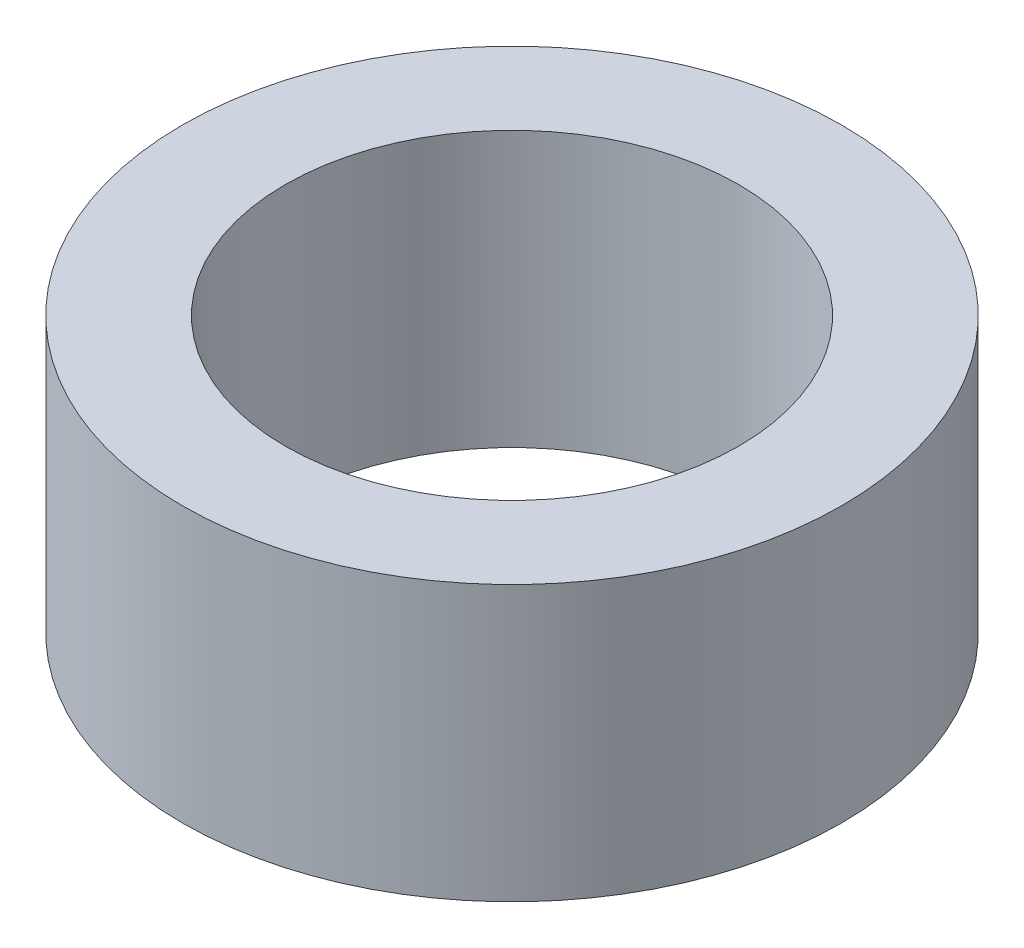
ISO-10303-21;
HEADER;
FILE_DESCRIPTION(('STEP AP214'),'2;1');
FILE_NAME('part.step','',(''),(''),'','','');
FILE_SCHEMA(('AUTOMOTIVE_DESIGN { 1 0 10303 214 1 1 1 1 }'));
ENDSEC;
DATA;
#1=APPLICATION_CONTEXT('core data for automotive mechanical design processes');
#2=APPLICATION_PROTOCOL_DEFINITION('international standard','automotive_design',2000,#1);
#3=PRODUCT_CONTEXT('',#1,'mechanical');
#4=PRODUCT('Part','Part','',(#3));
#5=PRODUCT_RELATED_PRODUCT_CATEGORY('part','',(#4));
#6=PRODUCT_DEFINITION_FORMATION('','',#4);
#7=PRODUCT_DEFINITION_CONTEXT('part definition',#1,'design');
#8=PRODUCT_DEFINITION('design','',#6,#7);
#9=PRODUCT_DEFINITION_SHAPE('','',#8);
#10=(LENGTH_UNIT() NAMED_UNIT(*) SI_UNIT(.MILLI.,.METRE.));
#11=(NAMED_UNIT(*) PLANE_ANGLE_UNIT() SI_UNIT($,.RADIAN.));
#12=(NAMED_UNIT(*) SI_UNIT($,.STERADIAN.) SOLID_ANGLE_UNIT());
#13=UNCERTAINTY_MEASURE_WITH_UNIT(LENGTH_MEASURE(1.E-05),#10,'distance_accuracy_value','');
#14=(GEOMETRIC_REPRESENTATION_CONTEXT(3) GLOBAL_UNCERTAINTY_ASSIGNED_CONTEXT((#13)) GLOBAL_UNIT_ASSIGNED_CONTEXT((#10,
#11,#12)) REPRESENTATION_CONTEXT('',''));
#15=CARTESIAN_POINT('',(0.,0.,0.));
#16=DIRECTION('',(0.,0.,1.));
#17=DIRECTION('',(1.,0.,0.));
#18=AXIS2_PLACEMENT_3D('',#15,#16,#17);
#19=CARTESIAN_POINT('',(0.,5.,0.));
#20=DIRECTION('',(0.,1.,0.));
#21=DIRECTION('',(0.,0.,1.));
#22=AXIS2_PLACEMENT_3D('',#19,#20,#21);
#23=PLANE('',#22);
#24=CARTESIAN_POINT('',(0.,5.,0.));
#25=DIRECTION('',(0.,1.,0.));
#26=DIRECTION('',(0.,0.,1.));
#27=AXIS2_PLACEMENT_3D('',#24,#25,#26);
#28=CIRCLE('',#27,6.);
#29=CARTESIAN_POINT('',(0.,5.,6.));
#30=VERTEX_POINT('',#29);
#31=EDGE_CURVE('E10',#30,#30,#28,.T.);
#32=ORIENTED_EDGE('',*,*,#31,.T.);
#33=EDGE_LOOP('',(#32));
#34=FACE_BOUND('',#33,.T.);
#35=CARTESIAN_POINT('',(0.,5.,0.));
#36=DIRECTION('',(0.,1.,0.));
#37=DIRECTION('',(0.,0.,1.));
#38=AXIS2_PLACEMENT_3D('',#35,#36,#37);
#39=CIRCLE('',#38,4.125);
#40=CARTESIAN_POINT('',(0.,5.,4.125));
#41=VERTEX_POINT('',#40);
#42=EDGE_CURVE('E52',#41,#41,#39,.T.);
#43=ORIENTED_EDGE('',*,*,#42,.F.);
#44=EDGE_LOOP('',(#43));
#45=FACE_BOUND('',#44,.T.);
#46=ADVANCED_FACE('F41',(#34,#45),#23,.T.);
#47=CARTESIAN_POINT('',(0.,0.,0.));
#48=DIRECTION('',(0.,1.,0.));
#49=DIRECTION('',(0.,0.,1.));
#50=AXIS2_PLACEMENT_3D('',#47,#48,#49);
#51=PLANE('',#50);
#52=CARTESIAN_POINT('',(0.,0.,0.));
#53=DIRECTION('',(0.,1.,0.));
#54=DIRECTION('',(0.,0.,1.));
#55=AXIS2_PLACEMENT_3D('',#52,#53,#54);
#56=CIRCLE('',#55,6.);
#57=CARTESIAN_POINT('',(0.,0.,6.));
#58=VERTEX_POINT('',#57);
#59=EDGE_CURVE('E45',#58,#58,#56,.T.);
#60=ORIENTED_EDGE('',*,*,#59,.F.);
#61=EDGE_LOOP('',(#60));
#62=FACE_BOUND('',#61,.T.);
#63=CARTESIAN_POINT('',(0.,0.,0.));
#64=DIRECTION('',(0.,1.,0.));
#65=DIRECTION('',(0.,0.,1.));
#66=AXIS2_PLACEMENT_3D('',#63,#64,#65);
#67=CIRCLE('',#66,4.125);
#68=CARTESIAN_POINT('',(0.,0.,4.125));
#69=VERTEX_POINT('',#68);
#70=EDGE_CURVE('E54',#69,#69,#67,.T.);
#71=ORIENTED_EDGE('',*,*,#70,.T.);
#72=EDGE_LOOP('',(#71));
#73=FACE_BOUND('',#72,.T.);
#74=ADVANCED_FACE('F64',(#62,#73),#51,.F.);
#75=CARTESIAN_POINT('',(0.,5.,0.));
#76=DIRECTION('',(0.,-1.,0.));
#77=DIRECTION('',(0.,0.,-1.));
#78=AXIS2_PLACEMENT_3D('',#75,#76,#77);
#79=CYLINDRICAL_SURFACE('',#78,6.);
#80=ORIENTED_EDGE('',*,*,#31,.F.);
#81=EDGE_LOOP('',(#80));
#82=FACE_BOUND('',#81,.T.);
#83=ORIENTED_EDGE('',*,*,#59,.T.);
#84=EDGE_LOOP('',(#83));
#85=FACE_BOUND('',#84,.T.);
#86=ADVANCED_FACE('F43',(#82,#85),#79,.T.);
#87=CARTESIAN_POINT('',(0.,5.,0.));
#88=DIRECTION('',(0.,-1.,0.));
#89=DIRECTION('',(0.,0.,-1.));
#90=AXIS2_PLACEMENT_3D('',#87,#88,#89);
#91=CYLINDRICAL_SURFACE('',#90,4.125);
#92=ORIENTED_EDGE('',*,*,#42,.T.);
#93=EDGE_LOOP('',(#92));
#94=FACE_BOUND('',#93,.T.);
#95=ORIENTED_EDGE('',*,*,#70,.F.);
#96=EDGE_LOOP('',(#95));
#97=FACE_BOUND('',#96,.T.);
#98=ADVANCED_FACE('F60',(#94,#97),#91,.F.);
#99=CLOSED_SHELL('',(#46,#74,#86,#98));
#100=MANIFOLD_SOLID_BREP('B2',#99);
#101=ADVANCED_BREP_SHAPE_REPRESENTATION('',(#18,#100),#14);
#102=SHAPE_DEFINITION_REPRESENTATION(#9,#101);
ENDSEC;
END-ISO-10303-21;
